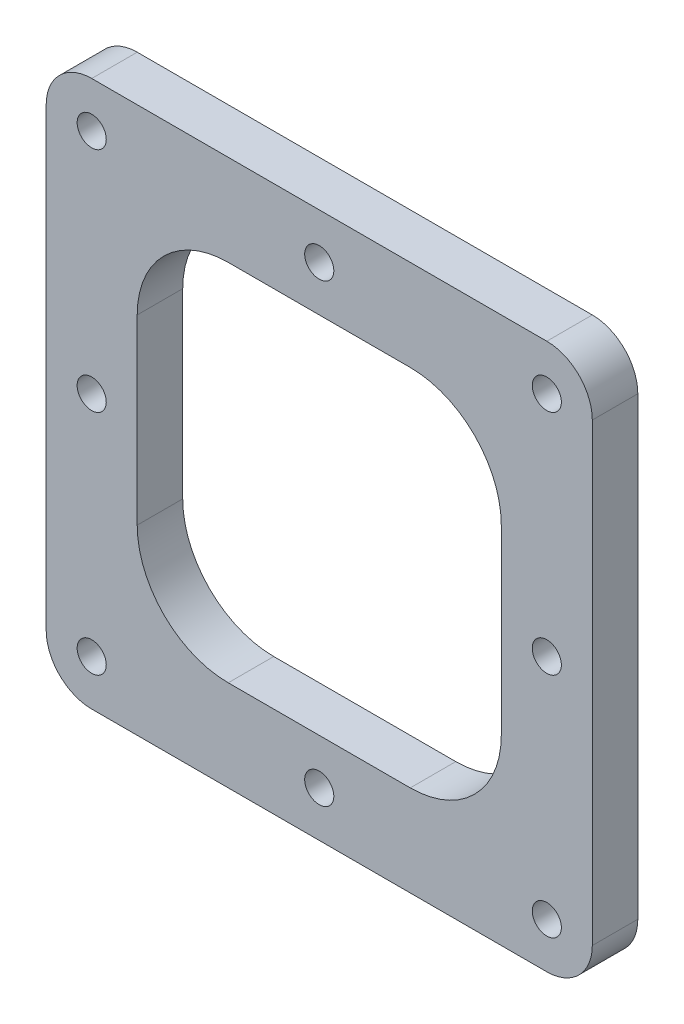
ISO-10303-21;
HEADER;
FILE_DESCRIPTION(('STEP AP214'),'2;1');
FILE_NAME('part.step','',(''),(''),'','','');
FILE_SCHEMA(('AUTOMOTIVE_DESIGN { 1 0 10303 214 1 1 1 1 }'));
ENDSEC;
DATA;
#1=APPLICATION_CONTEXT('core data for automotive mechanical design processes');
#2=APPLICATION_PROTOCOL_DEFINITION('international standard','automotive_design',2000,#1);
#3=PRODUCT_CONTEXT('',#1,'mechanical');
#4=PRODUCT('Part','Part','',(#3));
#5=PRODUCT_RELATED_PRODUCT_CATEGORY('part','',(#4));
#6=PRODUCT_DEFINITION_FORMATION('','',#4);
#7=PRODUCT_DEFINITION_CONTEXT('part definition',#1,'design');
#8=PRODUCT_DEFINITION('design','',#6,#7);
#9=PRODUCT_DEFINITION_SHAPE('','',#8);
#10=(LENGTH_UNIT() NAMED_UNIT(*) SI_UNIT(.MILLI.,.METRE.));
#11=(NAMED_UNIT(*) PLANE_ANGLE_UNIT() SI_UNIT($,.RADIAN.));
#12=(NAMED_UNIT(*) SI_UNIT($,.STERADIAN.) SOLID_ANGLE_UNIT());
#13=UNCERTAINTY_MEASURE_WITH_UNIT(LENGTH_MEASURE(1.E-05),#10,'distance_accuracy_value','');
#14=(GEOMETRIC_REPRESENTATION_CONTEXT(3) GLOBAL_UNCERTAINTY_ASSIGNED_CONTEXT((#13)) GLOBAL_UNIT_ASSIGNED_CONTEXT((#10,
#11,#12)) REPRESENTATION_CONTEXT('',''));
#15=CARTESIAN_POINT('',(0.,0.,0.));
#16=DIRECTION('',(0.,0.,1.));
#17=DIRECTION('',(1.,0.,0.));
#18=AXIS2_PLACEMENT_3D('',#15,#16,#17);
#19=CARTESIAN_POINT('',(5.,5.,5.));
#20=DIRECTION('',(0.,0.,-1.));
#21=DIRECTION('',(-1.,0.,0.));
#22=AXIS2_PLACEMENT_3D('',#19,#20,#21);
#23=CYLINDRICAL_SURFACE('',#22,5.);
#24=CARTESIAN_POINT('',(5.,5.,0.));
#25=DIRECTION('',(0.,0.,1.));
#26=DIRECTION('',(-1.,0.,0.));
#27=AXIS2_PLACEMENT_3D('',#24,#25,#26);
#28=CIRCLE('',#27,5.);
#29=CARTESIAN_POINT('',(0.,5.00000000000004,0.));
#30=VERTEX_POINT('',#29);
#31=CARTESIAN_POINT('',(5.00000000000004,0.,0.));
#32=VERTEX_POINT('',#31);
#33=EDGE_CURVE('E178',#30,#32,#28,.T.);
#34=ORIENTED_EDGE('',*,*,#33,.T.);
#35=DIRECTION('',(0.,0.,-1.));
#36=VECTOR('',#35,1.);
#37=CARTESIAN_POINT('',(5.00000000000004,0.,5.));
#38=LINE('',#37,#36);
#39=CARTESIAN_POINT('',(5.00000000000004,0.,5.));
#40=VERTEX_POINT('',#39);
#41=EDGE_CURVE('E159',#40,#32,#38,.T.);
#42=ORIENTED_EDGE('',*,*,#41,.F.);
#43=CARTESIAN_POINT('',(5.,5.,5.));
#44=DIRECTION('',(0.,0.,1.));
#45=DIRECTION('',(-1.,0.,0.));
#46=AXIS2_PLACEMENT_3D('',#43,#44,#45);
#47=CIRCLE('',#46,5.);
#48=CARTESIAN_POINT('',(0.,5.00000000000004,5.));
#49=VERTEX_POINT('',#48);
#50=EDGE_CURVE('E166',#49,#40,#47,.T.);
#51=ORIENTED_EDGE('',*,*,#50,.F.);
#52=DIRECTION('',(0.,0.,-1.));
#53=VECTOR('',#52,1.);
#54=CARTESIAN_POINT('',(0.,5.00000000000004,5.));
#55=LINE('',#54,#53);
#56=EDGE_CURVE('E269',#49,#30,#55,.T.);
#57=ORIENTED_EDGE('',*,*,#56,.T.);
#58=EDGE_LOOP('',(#34,#42,#51,#57));
#59=FACE_BOUND('',#58,.T.);
#60=ADVANCED_FACE('F41',(#59),#23,.T.);
#61=CARTESIAN_POINT('',(5.00000000000004,0.,5.));
#62=DIRECTION('',(0.,1.,0.));
#63=DIRECTION('',(0.,0.,1.));
#64=AXIS2_PLACEMENT_3D('',#61,#62,#63);
#65=PLANE('',#64);
#66=DIRECTION('',(1.,0.,0.));
#67=VECTOR('',#66,1.);
#68=CARTESIAN_POINT('',(5.00000000000004,0.,0.));
#69=LINE('',#68,#67);
#70=CARTESIAN_POINT('',(55.,0.,0.));
#71=VERTEX_POINT('',#70);
#72=EDGE_CURVE('E271',#32,#71,#69,.T.);
#73=ORIENTED_EDGE('',*,*,#72,.T.);
#74=DIRECTION('',(0.,0.,-1.));
#75=VECTOR('',#74,1.);
#76=CARTESIAN_POINT('',(55.,0.,5.));
#77=LINE('',#76,#75);
#78=CARTESIAN_POINT('',(55.,0.,5.));
#79=VERTEX_POINT('',#78);
#80=EDGE_CURVE('E162',#79,#71,#77,.T.);
#81=ORIENTED_EDGE('',*,*,#80,.F.);
#82=DIRECTION('',(1.,0.,0.));
#83=VECTOR('',#82,1.);
#84=CARTESIAN_POINT('',(5.00000000000004,0.,5.));
#85=LINE('',#84,#83);
#86=EDGE_CURVE('E155',#40,#79,#85,.T.);
#87=ORIENTED_EDGE('',*,*,#86,.F.);
#88=ORIENTED_EDGE('',*,*,#41,.T.);
#89=EDGE_LOOP('',(#73,#81,#87,#88));
#90=FACE_BOUND('',#89,.T.);
#91=ADVANCED_FACE('F157',(#90),#65,.F.);
#92=CARTESIAN_POINT('',(55.,5.,5.));
#93=DIRECTION('',(0.,0.,-1.));
#94=DIRECTION('',(-1.,0.,0.));
#95=AXIS2_PLACEMENT_3D('',#92,#93,#94);
#96=CYLINDRICAL_SURFACE('',#95,5.);
#97=CARTESIAN_POINT('',(55.,5.,0.));
#98=DIRECTION('',(0.,0.,1.));
#99=DIRECTION('',(1.,0.,0.));
#100=AXIS2_PLACEMENT_3D('',#97,#98,#99);
#101=CIRCLE('',#100,5.);
#102=CARTESIAN_POINT('',(60.,5.,0.));
#103=VERTEX_POINT('',#102);
#104=EDGE_CURVE('E273',#71,#103,#101,.T.);
#105=ORIENTED_EDGE('',*,*,#104,.T.);
#106=DIRECTION('',(0.,0.,-1.));
#107=VECTOR('',#106,1.);
#108=CARTESIAN_POINT('',(60.,5.,5.));
#109=LINE('',#108,#107);
#110=CARTESIAN_POINT('',(60.,5.,5.));
#111=VERTEX_POINT('',#110);
#112=EDGE_CURVE('E183',#111,#103,#109,.T.);
#113=ORIENTED_EDGE('',*,*,#112,.F.);
#114=CARTESIAN_POINT('',(55.,5.,5.));
#115=DIRECTION('',(0.,0.,1.));
#116=DIRECTION('',(1.,0.,0.));
#117=AXIS2_PLACEMENT_3D('',#114,#115,#116);
#118=CIRCLE('',#117,5.);
#119=EDGE_CURVE('E165',#79,#111,#118,.T.);
#120=ORIENTED_EDGE('',*,*,#119,.F.);
#121=ORIENTED_EDGE('',*,*,#80,.T.);
#122=EDGE_LOOP('',(#105,#113,#120,#121));
#123=FACE_BOUND('',#122,.T.);
#124=ADVANCED_FACE('F319',(#123),#96,.T.);
#125=CARTESIAN_POINT('',(60.,5.00000000000004,5.));
#126=DIRECTION('',(-1.,0.,0.));
#127=DIRECTION('',(0.,0.,1.));
#128=AXIS2_PLACEMENT_3D('',#125,#126,#127);
#129=PLANE('',#128);
#130=DIRECTION('',(0.,1.,0.));
#131=VECTOR('',#130,1.);
#132=CARTESIAN_POINT('',(60.,5.00000000000004,0.));
#133=LINE('',#132,#131);
#134=CARTESIAN_POINT('',(60.,55.,0.));
#135=VERTEX_POINT('',#134);
#136=EDGE_CURVE('E275',#103,#135,#133,.T.);
#137=ORIENTED_EDGE('',*,*,#136,.T.);
#138=DIRECTION('',(0.,0.,-1.));
#139=VECTOR('',#138,1.);
#140=CARTESIAN_POINT('',(60.,55.,5.));
#141=LINE('',#140,#139);
#142=CARTESIAN_POINT('',(60.,55.,5.));
#143=VERTEX_POINT('',#142);
#144=EDGE_CURVE('E294',#143,#135,#141,.T.);
#145=ORIENTED_EDGE('',*,*,#144,.F.);
#146=DIRECTION('',(0.,1.,0.));
#147=VECTOR('',#146,1.);
#148=CARTESIAN_POINT('',(60.,5.00000000000004,5.));
#149=LINE('',#148,#147);
#150=EDGE_CURVE('E260',#111,#143,#149,.T.);
#151=ORIENTED_EDGE('',*,*,#150,.F.);
#152=ORIENTED_EDGE('',*,*,#112,.T.);
#153=EDGE_LOOP('',(#137,#145,#151,#152));
#154=FACE_BOUND('',#153,.T.);
#155=ADVANCED_FACE('F301',(#154),#129,.F.);
#156=CARTESIAN_POINT('',(55.,55.,5.));
#157=DIRECTION('',(0.,0.,-1.));
#158=DIRECTION('',(-1.,0.,0.));
#159=AXIS2_PLACEMENT_3D('',#156,#157,#158);
#160=CYLINDRICAL_SURFACE('',#159,5.);
#161=CARTESIAN_POINT('',(55.,55.,0.));
#162=DIRECTION('',(0.,0.,1.));
#163=DIRECTION('',(-1.,0.,0.));
#164=AXIS2_PLACEMENT_3D('',#161,#162,#163);
#165=CIRCLE('',#164,5.);
#166=CARTESIAN_POINT('',(55.,60.,0.));
#167=VERTEX_POINT('',#166);
#168=EDGE_CURVE('E277',#135,#167,#165,.T.);
#169=ORIENTED_EDGE('',*,*,#168,.T.);
#170=DIRECTION('',(0.,0.,-1.));
#171=VECTOR('',#170,1.);
#172=CARTESIAN_POINT('',(55.,60.,5.));
#173=LINE('',#172,#171);
#174=CARTESIAN_POINT('',(55.,60.,5.));
#175=VERTEX_POINT('',#174);
#176=EDGE_CURVE('E291',#175,#167,#173,.T.);
#177=ORIENTED_EDGE('',*,*,#176,.F.);
#178=CARTESIAN_POINT('',(55.,55.,5.));
#179=DIRECTION('',(0.,0.,1.));
#180=DIRECTION('',(-1.,0.,0.));
#181=AXIS2_PLACEMENT_3D('',#178,#179,#180);
#182=CIRCLE('',#181,5.);
#183=EDGE_CURVE('E262',#143,#175,#182,.T.);
#184=ORIENTED_EDGE('',*,*,#183,.F.);
#185=ORIENTED_EDGE('',*,*,#144,.T.);
#186=EDGE_LOOP('',(#169,#177,#184,#185));
#187=FACE_BOUND('',#186,.T.);
#188=ADVANCED_FACE('F311',(#187),#160,.T.);
#189=CARTESIAN_POINT('',(5.00000000000004,60.,5.));
#190=DIRECTION('',(0.,-1.,0.));
#191=DIRECTION('',(0.,0.,-1.));
#192=AXIS2_PLACEMENT_3D('',#189,#190,#191);
#193=PLANE('',#192);
#194=DIRECTION('',(-1.,0.,0.));
#195=VECTOR('',#194,1.);
#196=CARTESIAN_POINT('',(5.00000000000004,60.,0.));
#197=LINE('',#196,#195);
#198=CARTESIAN_POINT('',(5.00000000000004,60.,0.));
#199=VERTEX_POINT('',#198);
#200=EDGE_CURVE('E279',#167,#199,#197,.T.);
#201=ORIENTED_EDGE('',*,*,#200,.T.);
#202=DIRECTION('',(0.,0.,-1.));
#203=VECTOR('',#202,1.);
#204=CARTESIAN_POINT('',(5.00000000000004,60.,5.));
#205=LINE('',#204,#203);
#206=CARTESIAN_POINT('',(5.00000000000004,60.,5.));
#207=VERTEX_POINT('',#206);
#208=EDGE_CURVE('E288',#207,#199,#205,.T.);
#209=ORIENTED_EDGE('',*,*,#208,.F.);
#210=DIRECTION('',(-1.,0.,0.));
#211=VECTOR('',#210,1.);
#212=CARTESIAN_POINT('',(5.00000000000004,60.,5.));
#213=LINE('',#212,#211);
#214=EDGE_CURVE('E264',#175,#207,#213,.T.);
#215=ORIENTED_EDGE('',*,*,#214,.F.);
#216=ORIENTED_EDGE('',*,*,#176,.T.);
#217=EDGE_LOOP('',(#201,#209,#215,#216));
#218=FACE_BOUND('',#217,.T.);
#219=ADVANCED_FACE('F315',(#218),#193,.F.);
#220=CARTESIAN_POINT('',(5.,55.,5.));
#221=DIRECTION('',(0.,0.,-1.));
#222=DIRECTION('',(-1.,0.,0.));
#223=AXIS2_PLACEMENT_3D('',#220,#221,#222);
#224=CYLINDRICAL_SURFACE('',#223,5.);
#225=CARTESIAN_POINT('',(5.,55.,0.));
#226=DIRECTION('',(0.,0.,1.));
#227=DIRECTION('',(-1.,0.,0.));
#228=AXIS2_PLACEMENT_3D('',#225,#226,#227);
#229=CIRCLE('',#228,5.);
#230=CARTESIAN_POINT('',(0.,55.,0.));
#231=VERTEX_POINT('',#230);
#232=EDGE_CURVE('E281',#199,#231,#229,.T.);
#233=ORIENTED_EDGE('',*,*,#232,.T.);
#234=DIRECTION('',(0.,0.,-1.));
#235=VECTOR('',#234,1.);
#236=CARTESIAN_POINT('',(0.,55.,5.));
#237=LINE('',#236,#235);
#238=CARTESIAN_POINT('',(0.,55.,5.));
#239=VERTEX_POINT('',#238);
#240=EDGE_CURVE('E285',#239,#231,#237,.T.);
#241=ORIENTED_EDGE('',*,*,#240,.F.);
#242=CARTESIAN_POINT('',(5.,55.,5.));
#243=DIRECTION('',(0.,0.,1.));
#244=DIRECTION('',(-1.,0.,0.));
#245=AXIS2_PLACEMENT_3D('',#242,#243,#244);
#246=CIRCLE('',#245,5.);
#247=EDGE_CURVE('E266',#207,#239,#246,.T.);
#248=ORIENTED_EDGE('',*,*,#247,.F.);
#249=ORIENTED_EDGE('',*,*,#208,.T.);
#250=EDGE_LOOP('',(#233,#241,#248,#249));
#251=FACE_BOUND('',#250,.T.);
#252=ADVANCED_FACE('F401',(#251),#224,.T.);
#253=CARTESIAN_POINT('',(0.,5.00000000000004,5.));
#254=DIRECTION('',(1.,0.,0.));
#255=DIRECTION('',(0.,0.,-1.));
#256=AXIS2_PLACEMENT_3D('',#253,#254,#255);
#257=PLANE('',#256);
#258=DIRECTION('',(0.,-1.,0.));
#259=VECTOR('',#258,1.);
#260=CARTESIAN_POINT('',(0.,5.00000000000004,0.));
#261=LINE('',#260,#259);
#262=EDGE_CURVE('E175',#231,#30,#261,.T.);
#263=ORIENTED_EDGE('',*,*,#262,.T.);
#264=ORIENTED_EDGE('',*,*,#56,.F.);
#265=DIRECTION('',(0.,-1.,0.));
#266=VECTOR('',#265,1.);
#267=CARTESIAN_POINT('',(0.,5.00000000000004,5.));
#268=LINE('',#267,#266);
#269=EDGE_CURVE('E171',#239,#49,#268,.T.);
#270=ORIENTED_EDGE('',*,*,#269,.F.);
#271=ORIENTED_EDGE('',*,*,#240,.T.);
#272=EDGE_LOOP('',(#263,#264,#270,#271));
#273=FACE_BOUND('',#272,.T.);
#274=ADVANCED_FACE('F394',(#273),#257,.F.);
#275=CARTESIAN_POINT('',(5.,5.,5.));
#276=DIRECTION('',(0.,0.,-1.));
#277=DIRECTION('',(-1.,0.,0.));
#278=AXIS2_PLACEMENT_3D('',#275,#276,#277);
#279=PLANE('',#278);
#280=CARTESIAN_POINT('',(30.,55.,5.));
#281=DIRECTION('',(0.,0.,1.));
#282=DIRECTION('',(1.,0.,0.));
#283=AXIS2_PLACEMENT_3D('',#280,#281,#282);
#284=CIRCLE('',#283,1.6);
#285=CARTESIAN_POINT('',(31.6,55.,5.));
#286=VERTEX_POINT('',#285);
#287=EDGE_CURVE('E257',#286,#286,#284,.T.);
#288=ORIENTED_EDGE('',*,*,#287,.F.);
#289=EDGE_LOOP('',(#288));
#290=FACE_BOUND('',#289,.T.);
#291=CARTESIAN_POINT('',(55.,55.,5.));
#292=DIRECTION('',(0.,0.,1.));
#293=DIRECTION('',(1.,0.,0.));
#294=AXIS2_PLACEMENT_3D('',#291,#292,#293);
#295=CIRCLE('',#294,1.6);
#296=CARTESIAN_POINT('',(56.6,55.,5.));
#297=VERTEX_POINT('',#296);
#298=EDGE_CURVE('E582',#297,#297,#295,.T.);
#299=ORIENTED_EDGE('',*,*,#298,.F.);
#300=EDGE_LOOP('',(#299));
#301=FACE_BOUND('',#300,.T.);
#302=DIRECTION('',(1.,0.,0.));
#303=VECTOR('',#302,1.);
#304=CARTESIAN_POINT('',(10.,10.,5.));
#305=LINE('',#304,#303);
#306=CARTESIAN_POINT('',(20.,10.,5.));
#307=VERTEX_POINT('',#306);
#308=CARTESIAN_POINT('',(40.,10.,5.));
#309=VERTEX_POINT('',#308);
#310=EDGE_CURVE('E354',#307,#309,#305,.T.);
#311=ORIENTED_EDGE('',*,*,#310,.F.);
#312=CARTESIAN_POINT('',(20.,20.,5.));
#313=DIRECTION('',(0.,0.,-1.));
#314=DIRECTION('',(-1.,0.,0.));
#315=AXIS2_PLACEMENT_3D('',#312,#313,#314);
#316=CIRCLE('',#315,10.);
#317=CARTESIAN_POINT('',(10.,20.,5.));
#318=VERTEX_POINT('',#317);
#319=EDGE_CURVE('E203',#307,#318,#316,.T.);
#320=ORIENTED_EDGE('',*,*,#319,.T.);
#321=DIRECTION('',(0.,-1.,0.));
#322=VECTOR('',#321,1.);
#323=CARTESIAN_POINT('',(10.,50.,5.));
#324=LINE('',#323,#322);
#325=CARTESIAN_POINT('',(10.,40.,5.));
#326=VERTEX_POINT('',#325);
#327=EDGE_CURVE('E220',#326,#318,#324,.T.);
#328=ORIENTED_EDGE('',*,*,#327,.F.);
#329=CARTESIAN_POINT('',(20.,40.,5.));
#330=DIRECTION('',(0.,0.,-1.));
#331=DIRECTION('',(-1.,0.,0.));
#332=AXIS2_PLACEMENT_3D('',#329,#330,#331);
#333=CIRCLE('',#332,10.);
#334=CARTESIAN_POINT('',(20.,50.,5.));
#335=VERTEX_POINT('',#334);
#336=EDGE_CURVE('E49',#326,#335,#333,.T.);
#337=ORIENTED_EDGE('',*,*,#336,.T.);
#338=DIRECTION('',(-1.,0.,0.));
#339=VECTOR('',#338,1.);
#340=CARTESIAN_POINT('',(50.,50.,5.));
#341=LINE('',#340,#339);
#342=CARTESIAN_POINT('',(40.,50.,5.));
#343=VERTEX_POINT('',#342);
#344=EDGE_CURVE('E218',#343,#335,#341,.T.);
#345=ORIENTED_EDGE('',*,*,#344,.F.);
#346=CARTESIAN_POINT('',(40.,40.,5.));
#347=DIRECTION('',(0.,0.,-1.));
#348=DIRECTION('',(-1.,0.,0.));
#349=AXIS2_PLACEMENT_3D('',#346,#347,#348);
#350=CIRCLE('',#349,10.);
#351=CARTESIAN_POINT('',(50.,40.,5.));
#352=VERTEX_POINT('',#351);
#353=EDGE_CURVE('E211',#343,#352,#350,.T.);
#354=ORIENTED_EDGE('',*,*,#353,.T.);
#355=DIRECTION('',(0.,1.,0.));
#356=VECTOR('',#355,1.);
#357=CARTESIAN_POINT('',(50.,10.,5.));
#358=LINE('',#357,#356);
#359=CARTESIAN_POINT('',(50.,20.,5.));
#360=VERTEX_POINT('',#359);
#361=EDGE_CURVE('E225',#360,#352,#358,.T.);
#362=ORIENTED_EDGE('',*,*,#361,.F.);
#363=CARTESIAN_POINT('',(40.,20.,5.));
#364=DIRECTION('',(0.,0.,-1.));
#365=DIRECTION('',(-1.,0.,0.));
#366=AXIS2_PLACEMENT_3D('',#363,#364,#365);
#367=CIRCLE('',#366,10.);
#368=EDGE_CURVE('E207',#360,#309,#367,.T.);
#369=ORIENTED_EDGE('',*,*,#368,.T.);
#370=EDGE_LOOP('',(#311,#320,#328,#337,#345,#354,#362,#369));
#371=FACE_BOUND('',#370,.T.);
#372=CARTESIAN_POINT('',(55.0000000000003,30.,5.));
#373=DIRECTION('',(0.,0.,1.));
#374=DIRECTION('',(1.,0.,0.));
#375=AXIS2_PLACEMENT_3D('',#372,#373,#374);
#376=CIRCLE('',#375,1.6);
#377=CARTESIAN_POINT('',(56.6000000000003,30.,5.));
#378=VERTEX_POINT('',#377);
#379=EDGE_CURVE('E245',#378,#378,#376,.T.);
#380=ORIENTED_EDGE('',*,*,#379,.F.);
#381=EDGE_LOOP('',(#380));
#382=FACE_BOUND('',#381,.T.);
#383=CARTESIAN_POINT('',(30.0000000000005,5.,5.));
#384=DIRECTION('',(0.,0.,1.));
#385=DIRECTION('',(1.,0.,0.));
#386=AXIS2_PLACEMENT_3D('',#383,#384,#385);
#387=CIRCLE('',#386,1.6);
#388=CARTESIAN_POINT('',(31.6000000000005,5.,5.));
#389=VERTEX_POINT('',#388);
#390=EDGE_CURVE('E251',#389,#389,#387,.T.);
#391=ORIENTED_EDGE('',*,*,#390,.F.);
#392=EDGE_LOOP('',(#391));
#393=FACE_BOUND('',#392,.T.);
#394=CARTESIAN_POINT('',(55.0000000000005,5.,5.));
#395=DIRECTION('',(0.,0.,1.));
#396=DIRECTION('',(1.,0.,0.));
#397=AXIS2_PLACEMENT_3D('',#394,#395,#396);
#398=CIRCLE('',#397,1.6);
#399=CARTESIAN_POINT('',(56.6000000000005,5.,5.));
#400=VERTEX_POINT('',#399);
#401=EDGE_CURVE('E608',#400,#400,#398,.T.);
#402=ORIENTED_EDGE('',*,*,#401,.F.);
#403=EDGE_LOOP('',(#402));
#404=FACE_BOUND('',#403,.T.);
#405=CARTESIAN_POINT('',(5.00000000000026,30.,5.));
#406=DIRECTION('',(0.,0.,1.));
#407=DIRECTION('',(1.,0.,0.));
#408=AXIS2_PLACEMENT_3D('',#405,#406,#407);
#409=CIRCLE('',#408,1.6);
#410=CARTESIAN_POINT('',(6.60000000000026,30.,5.));
#411=VERTEX_POINT('',#410);
#412=EDGE_CURVE('E602',#411,#411,#409,.T.);
#413=ORIENTED_EDGE('',*,*,#412,.F.);
#414=EDGE_LOOP('',(#413));
#415=FACE_BOUND('',#414,.T.);
#416=CARTESIAN_POINT('',(5.00000000000052,5.,5.));
#417=DIRECTION('',(0.,0.,1.));
#418=DIRECTION('',(1.,0.,0.));
#419=AXIS2_PLACEMENT_3D('',#416,#417,#418);
#420=CIRCLE('',#419,1.6);
#421=CARTESIAN_POINT('',(6.60000000000052,5.,5.));
#422=VERTEX_POINT('',#421);
#423=EDGE_CURVE('E596',#422,#422,#420,.T.);
#424=ORIENTED_EDGE('',*,*,#423,.F.);
#425=EDGE_LOOP('',(#424));
#426=FACE_BOUND('',#425,.T.);
#427=CARTESIAN_POINT('',(5.,55.,5.));
#428=DIRECTION('',(0.,0.,1.));
#429=DIRECTION('',(1.,0.,0.));
#430=AXIS2_PLACEMENT_3D('',#427,#428,#429);
#431=CIRCLE('',#430,1.6);
#432=CARTESIAN_POINT('',(6.6,55.,5.));
#433=VERTEX_POINT('',#432);
#434=EDGE_CURVE('E255',#433,#433,#431,.T.);
#435=ORIENTED_EDGE('',*,*,#434,.F.);
#436=EDGE_LOOP('',(#435));
#437=FACE_BOUND('',#436,.T.);
#438=ORIENTED_EDGE('',*,*,#50,.T.);
#439=ORIENTED_EDGE('',*,*,#86,.T.);
#440=ORIENTED_EDGE('',*,*,#119,.T.);
#441=ORIENTED_EDGE('',*,*,#150,.T.);
#442=ORIENTED_EDGE('',*,*,#183,.T.);
#443=ORIENTED_EDGE('',*,*,#214,.T.);
#444=ORIENTED_EDGE('',*,*,#247,.T.);
#445=ORIENTED_EDGE('',*,*,#269,.T.);
#446=EDGE_LOOP('',(#438,#439,#440,#441,#442,#443,#444,#445));
#447=FACE_BOUND('',#446,.T.);
#448=ADVANCED_FACE('F169',(#290,#301,#371,#382,#393,#404,#415,#426,#437,#447),#279,.F.);
#449=CARTESIAN_POINT('',(5.,5.,0.));
#450=DIRECTION('',(0.,0.,-1.));
#451=DIRECTION('',(-1.,0.,0.));
#452=AXIS2_PLACEMENT_3D('',#449,#450,#451);
#453=PLANE('',#452);
#454=CARTESIAN_POINT('',(30.,55.,0.));
#455=DIRECTION('',(0.,0.,1.));
#456=DIRECTION('',(1.,0.,0.));
#457=AXIS2_PLACEMENT_3D('',#454,#455,#456);
#458=CIRCLE('',#457,1.6);
#459=CARTESIAN_POINT('',(31.6,55.,0.));
#460=VERTEX_POINT('',#459);
#461=EDGE_CURVE('E578',#460,#460,#458,.T.);
#462=ORIENTED_EDGE('',*,*,#461,.T.);
#463=EDGE_LOOP('',(#462));
#464=FACE_BOUND('',#463,.T.);
#465=CARTESIAN_POINT('',(55.,55.,0.));
#466=DIRECTION('',(0.,0.,1.));
#467=DIRECTION('',(1.,0.,0.));
#468=AXIS2_PLACEMENT_3D('',#465,#466,#467);
#469=CIRCLE('',#468,1.6);
#470=CARTESIAN_POINT('',(56.6,55.,0.));
#471=VERTEX_POINT('',#470);
#472=EDGE_CURVE('E361',#471,#471,#469,.T.);
#473=ORIENTED_EDGE('',*,*,#472,.T.);
#474=EDGE_LOOP('',(#473));
#475=FACE_BOUND('',#474,.T.);
#476=DIRECTION('',(-1.,0.,0.));
#477=VECTOR('',#476,1.);
#478=CARTESIAN_POINT('',(50.,50.,0.));
#479=LINE('',#478,#477);
#480=CARTESIAN_POINT('',(40.,50.,0.));
#481=VERTEX_POINT('',#480);
#482=CARTESIAN_POINT('',(20.,50.,0.));
#483=VERTEX_POINT('',#482);
#484=EDGE_CURVE('E234',#481,#483,#479,.T.);
#485=ORIENTED_EDGE('',*,*,#484,.T.);
#486=CARTESIAN_POINT('',(20.,40.,0.));
#487=DIRECTION('',(0.,0.,-1.));
#488=DIRECTION('',(-1.,0.,0.));
#489=AXIS2_PLACEMENT_3D('',#486,#487,#488);
#490=CIRCLE('',#489,10.);
#491=CARTESIAN_POINT('',(10.,40.,0.));
#492=VERTEX_POINT('',#491);
#493=EDGE_CURVE('E11',#483,#492,#490,.F.);
#494=ORIENTED_EDGE('',*,*,#493,.T.);
#495=DIRECTION('',(0.,-1.,0.));
#496=VECTOR('',#495,1.);
#497=CARTESIAN_POINT('',(10.,50.,0.));
#498=LINE('',#497,#496);
#499=CARTESIAN_POINT('',(10.,20.,0.));
#500=VERTEX_POINT('',#499);
#501=EDGE_CURVE('E226',#492,#500,#498,.T.);
#502=ORIENTED_EDGE('',*,*,#501,.T.);
#503=CARTESIAN_POINT('',(20.,20.,0.));
#504=DIRECTION('',(0.,0.,-1.));
#505=DIRECTION('',(-1.,0.,0.));
#506=AXIS2_PLACEMENT_3D('',#503,#504,#505);
#507=CIRCLE('',#506,10.);
#508=CARTESIAN_POINT('',(20.,10.,0.));
#509=VERTEX_POINT('',#508);
#510=EDGE_CURVE('E205',#500,#509,#507,.F.);
#511=ORIENTED_EDGE('',*,*,#510,.T.);
#512=DIRECTION('',(1.,0.,0.));
#513=VECTOR('',#512,1.);
#514=CARTESIAN_POINT('',(10.,10.,0.));
#515=LINE('',#514,#513);
#516=CARTESIAN_POINT('',(40.,10.,0.));
#517=VERTEX_POINT('',#516);
#518=EDGE_CURVE('E238',#509,#517,#515,.T.);
#519=ORIENTED_EDGE('',*,*,#518,.T.);
#520=CARTESIAN_POINT('',(40.,20.,0.));
#521=DIRECTION('',(0.,0.,-1.));
#522=DIRECTION('',(-1.,0.,0.));
#523=AXIS2_PLACEMENT_3D('',#520,#521,#522);
#524=CIRCLE('',#523,10.);
#525=CARTESIAN_POINT('',(50.,20.,0.));
#526=VERTEX_POINT('',#525);
#527=EDGE_CURVE('E209',#517,#526,#524,.F.);
#528=ORIENTED_EDGE('',*,*,#527,.T.);
#529=DIRECTION('',(0.,1.,0.));
#530=VECTOR('',#529,1.);
#531=CARTESIAN_POINT('',(50.,10.,0.));
#532=LINE('',#531,#530);
#533=CARTESIAN_POINT('',(50.,40.,0.));
#534=VERTEX_POINT('',#533);
#535=EDGE_CURVE('E241',#526,#534,#532,.T.);
#536=ORIENTED_EDGE('',*,*,#535,.T.);
#537=CARTESIAN_POINT('',(40.,40.,0.));
#538=DIRECTION('',(0.,0.,-1.));
#539=DIRECTION('',(-1.,0.,0.));
#540=AXIS2_PLACEMENT_3D('',#537,#538,#539);
#541=CIRCLE('',#540,10.);
#542=EDGE_CURVE('E63',#534,#481,#541,.F.);
#543=ORIENTED_EDGE('',*,*,#542,.T.);
#544=EDGE_LOOP('',(#485,#494,#502,#511,#519,#528,#536,#543));
#545=FACE_BOUND('',#544,.T.);
#546=CARTESIAN_POINT('',(55.0000000000003,30.,0.));
#547=DIRECTION('',(0.,0.,1.));
#548=DIRECTION('',(1.,0.,0.));
#549=AXIS2_PLACEMENT_3D('',#546,#547,#548);
#550=CIRCLE('',#549,1.6);
#551=CARTESIAN_POINT('',(56.6000000000003,30.,0.));
#552=VERTEX_POINT('',#551);
#553=EDGE_CURVE('E248',#552,#552,#550,.T.);
#554=ORIENTED_EDGE('',*,*,#553,.T.);
#555=EDGE_LOOP('',(#554));
#556=FACE_BOUND('',#555,.T.);
#557=CARTESIAN_POINT('',(30.0000000000005,5.,0.));
#558=DIRECTION('',(0.,0.,1.));
#559=DIRECTION('',(1.,0.,0.));
#560=AXIS2_PLACEMENT_3D('',#557,#558,#559);
#561=CIRCLE('',#560,1.6);
#562=CARTESIAN_POINT('',(31.6000000000005,5.,0.));
#563=VERTEX_POINT('',#562);
#564=EDGE_CURVE('E611',#563,#563,#561,.T.);
#565=ORIENTED_EDGE('',*,*,#564,.T.);
#566=EDGE_LOOP('',(#565));
#567=FACE_BOUND('',#566,.T.);
#568=CARTESIAN_POINT('',(55.0000000000005,5.,0.));
#569=DIRECTION('',(0.,0.,1.));
#570=DIRECTION('',(1.,0.,0.));
#571=AXIS2_PLACEMENT_3D('',#568,#569,#570);
#572=CIRCLE('',#571,1.6);
#573=CARTESIAN_POINT('',(56.6000000000005,5.,0.));
#574=VERTEX_POINT('',#573);
#575=EDGE_CURVE('E605',#574,#574,#572,.T.);
#576=ORIENTED_EDGE('',*,*,#575,.T.);
#577=EDGE_LOOP('',(#576));
#578=FACE_BOUND('',#577,.T.);
#579=CARTESIAN_POINT('',(5.00000000000026,30.,0.));
#580=DIRECTION('',(0.,0.,1.));
#581=DIRECTION('',(1.,0.,0.));
#582=AXIS2_PLACEMENT_3D('',#579,#580,#581);
#583=CIRCLE('',#582,1.6);
#584=CARTESIAN_POINT('',(6.60000000000026,30.,0.));
#585=VERTEX_POINT('',#584);
#586=EDGE_CURVE('E599',#585,#585,#583,.T.);
#587=ORIENTED_EDGE('',*,*,#586,.T.);
#588=EDGE_LOOP('',(#587));
#589=FACE_BOUND('',#588,.T.);
#590=CARTESIAN_POINT('',(5.00000000000052,5.,0.));
#591=DIRECTION('',(0.,0.,1.));
#592=DIRECTION('',(1.,0.,0.));
#593=AXIS2_PLACEMENT_3D('',#590,#591,#592);
#594=CIRCLE('',#593,1.6);
#595=CARTESIAN_POINT('',(6.60000000000052,5.,0.));
#596=VERTEX_POINT('',#595);
#597=EDGE_CURVE('E585',#596,#596,#594,.T.);
#598=ORIENTED_EDGE('',*,*,#597,.T.);
#599=EDGE_LOOP('',(#598));
#600=FACE_BOUND('',#599,.T.);
#601=CARTESIAN_POINT('',(5.,55.,0.));
#602=DIRECTION('',(0.,0.,1.));
#603=DIRECTION('',(1.,0.,0.));
#604=AXIS2_PLACEMENT_3D('',#601,#602,#603);
#605=CIRCLE('',#604,1.6);
#606=CARTESIAN_POINT('',(6.6,55.,0.));
#607=VERTEX_POINT('',#606);
#608=EDGE_CURVE('E252',#607,#607,#605,.T.);
#609=ORIENTED_EDGE('',*,*,#608,.T.);
#610=EDGE_LOOP('',(#609));
#611=FACE_BOUND('',#610,.T.);
#612=ORIENTED_EDGE('',*,*,#33,.F.);
#613=ORIENTED_EDGE('',*,*,#262,.F.);
#614=ORIENTED_EDGE('',*,*,#232,.F.);
#615=ORIENTED_EDGE('',*,*,#200,.F.);
#616=ORIENTED_EDGE('',*,*,#168,.F.);
#617=ORIENTED_EDGE('',*,*,#136,.F.);
#618=ORIENTED_EDGE('',*,*,#104,.F.);
#619=ORIENTED_EDGE('',*,*,#72,.F.);
#620=EDGE_LOOP('',(#612,#613,#614,#615,#616,#617,#618,#619));
#621=FACE_BOUND('',#620,.T.);
#622=ADVANCED_FACE('F231',(#464,#475,#545,#556,#567,#578,#589,#600,#611,#621),#453,.T.);
#623=CARTESIAN_POINT('',(5.,55.,0.));
#624=DIRECTION('',(0.,0.,1.));
#625=DIRECTION('',(1.,0.,0.));
#626=AXIS2_PLACEMENT_3D('',#623,#624,#625);
#627=CYLINDRICAL_SURFACE('',#626,1.6);
#628=ORIENTED_EDGE('',*,*,#608,.F.);
#629=EDGE_LOOP('',(#628));
#630=FACE_BOUND('',#629,.T.);
#631=ORIENTED_EDGE('',*,*,#434,.T.);
#632=EDGE_LOOP('',(#631));
#633=FACE_BOUND('',#632,.T.);
#634=ADVANCED_FACE('F387',(#630,#633),#627,.F.);
#635=CARTESIAN_POINT('',(5.00000000000052,5.,0.));
#636=DIRECTION('',(0.,0.,1.));
#637=DIRECTION('',(1.,0.,0.));
#638=AXIS2_PLACEMENT_3D('',#635,#636,#637);
#639=CYLINDRICAL_SURFACE('',#638,1.6);
#640=ORIENTED_EDGE('',*,*,#597,.F.);
#641=EDGE_LOOP('',(#640));
#642=FACE_BOUND('',#641,.T.);
#643=ORIENTED_EDGE('',*,*,#423,.T.);
#644=EDGE_LOOP('',(#643));
#645=FACE_BOUND('',#644,.T.);
#646=ADVANCED_FACE('F390',(#642,#645),#639,.F.);
#647=CARTESIAN_POINT('',(5.00000000000026,30.,0.));
#648=DIRECTION('',(0.,0.,1.));
#649=DIRECTION('',(1.,0.,0.));
#650=AXIS2_PLACEMENT_3D('',#647,#648,#649);
#651=CYLINDRICAL_SURFACE('',#650,1.6);
#652=ORIENTED_EDGE('',*,*,#586,.F.);
#653=EDGE_LOOP('',(#652));
#654=FACE_BOUND('',#653,.T.);
#655=ORIENTED_EDGE('',*,*,#412,.T.);
#656=EDGE_LOOP('',(#655));
#657=FACE_BOUND('',#656,.T.);
#658=ADVANCED_FACE('F442',(#654,#657),#651,.F.);
#659=CARTESIAN_POINT('',(55.0000000000005,5.,0.));
#660=DIRECTION('',(0.,0.,1.));
#661=DIRECTION('',(1.,0.,0.));
#662=AXIS2_PLACEMENT_3D('',#659,#660,#661);
#663=CYLINDRICAL_SURFACE('',#662,1.6);
#664=ORIENTED_EDGE('',*,*,#575,.F.);
#665=EDGE_LOOP('',(#664));
#666=FACE_BOUND('',#665,.T.);
#667=ORIENTED_EDGE('',*,*,#401,.T.);
#668=EDGE_LOOP('',(#667));
#669=FACE_BOUND('',#668,.T.);
#670=ADVANCED_FACE('F451',(#666,#669),#663,.F.);
#671=CARTESIAN_POINT('',(30.0000000000005,5.,0.));
#672=DIRECTION('',(0.,0.,1.));
#673=DIRECTION('',(1.,0.,0.));
#674=AXIS2_PLACEMENT_3D('',#671,#672,#673);
#675=CYLINDRICAL_SURFACE('',#674,1.6);
#676=ORIENTED_EDGE('',*,*,#564,.F.);
#677=EDGE_LOOP('',(#676));
#678=FACE_BOUND('',#677,.T.);
#679=ORIENTED_EDGE('',*,*,#390,.T.);
#680=EDGE_LOOP('',(#679));
#681=FACE_BOUND('',#680,.T.);
#682=ADVANCED_FACE('F385',(#678,#681),#675,.F.);
#683=CARTESIAN_POINT('',(55.0000000000003,30.,0.));
#684=DIRECTION('',(0.,0.,1.));
#685=DIRECTION('',(1.,0.,0.));
#686=AXIS2_PLACEMENT_3D('',#683,#684,#685);
#687=CYLINDRICAL_SURFACE('',#686,1.6);
#688=ORIENTED_EDGE('',*,*,#553,.F.);
#689=EDGE_LOOP('',(#688));
#690=FACE_BOUND('',#689,.T.);
#691=ORIENTED_EDGE('',*,*,#379,.T.);
#692=EDGE_LOOP('',(#691));
#693=FACE_BOUND('',#692,.T.);
#694=ADVANCED_FACE('F382',(#690,#693),#687,.F.);
#695=CARTESIAN_POINT('',(10.,50.,0.));
#696=DIRECTION('',(-1.,0.,0.));
#697=DIRECTION('',(0.,0.,1.));
#698=AXIS2_PLACEMENT_3D('',#695,#696,#697);
#699=PLANE('',#698);
#700=ORIENTED_EDGE('',*,*,#327,.T.);
#701=DIRECTION('',(0.,0.,1.));
#702=VECTOR('',#701,1.);
#703=CARTESIAN_POINT('',(10.,20.,0.));
#704=LINE('',#703,#702);
#705=EDGE_CURVE('E192',#318,#500,#704,.F.);
#706=ORIENTED_EDGE('',*,*,#705,.T.);
#707=ORIENTED_EDGE('',*,*,#501,.F.);
#708=DIRECTION('',(0.,0.,1.));
#709=VECTOR('',#708,1.);
#710=CARTESIAN_POINT('',(10.,40.,5.));
#711=LINE('',#710,#709);
#712=EDGE_CURVE('E189',#492,#326,#711,.T.);
#713=ORIENTED_EDGE('',*,*,#712,.T.);
#714=EDGE_LOOP('',(#700,#706,#707,#713));
#715=FACE_BOUND('',#714,.T.);
#716=ADVANCED_FACE('F236',(#715),#699,.F.);
#717=CARTESIAN_POINT('',(50.,50.,0.));
#718=DIRECTION('',(0.,1.,0.));
#719=DIRECTION('',(0.,0.,1.));
#720=AXIS2_PLACEMENT_3D('',#717,#718,#719);
#721=PLANE('',#720);
#722=ORIENTED_EDGE('',*,*,#484,.F.);
#723=DIRECTION('',(0.,0.,1.));
#724=VECTOR('',#723,1.);
#725=CARTESIAN_POINT('',(40.,50.,5.));
#726=LINE('',#725,#724);
#727=EDGE_CURVE('E200',#481,#343,#726,.T.);
#728=ORIENTED_EDGE('',*,*,#727,.T.);
#729=ORIENTED_EDGE('',*,*,#344,.T.);
#730=DIRECTION('',(0.,0.,1.));
#731=VECTOR('',#730,1.);
#732=CARTESIAN_POINT('',(20.,50.,0.));
#733=LINE('',#732,#731);
#734=EDGE_CURVE('E56',#335,#483,#733,.F.);
#735=ORIENTED_EDGE('',*,*,#734,.T.);
#736=EDGE_LOOP('',(#722,#728,#729,#735));
#737=FACE_BOUND('',#736,.T.);
#738=ADVANCED_FACE('F223',(#737),#721,.F.);
#739=CARTESIAN_POINT('',(50.,10.,0.));
#740=DIRECTION('',(1.,0.,0.));
#741=DIRECTION('',(0.,0.,-1.));
#742=AXIS2_PLACEMENT_3D('',#739,#740,#741);
#743=PLANE('',#742);
#744=ORIENTED_EDGE('',*,*,#535,.F.);
#745=DIRECTION('',(0.,0.,1.));
#746=VECTOR('',#745,1.);
#747=CARTESIAN_POINT('',(50.,20.,5.));
#748=LINE('',#747,#746);
#749=EDGE_CURVE('E196',#526,#360,#748,.T.);
#750=ORIENTED_EDGE('',*,*,#749,.T.);
#751=ORIENTED_EDGE('',*,*,#361,.T.);
#752=DIRECTION('',(0.,0.,1.));
#753=VECTOR('',#752,1.);
#754=CARTESIAN_POINT('',(50.,40.,0.));
#755=LINE('',#754,#753);
#756=EDGE_CURVE('E194',#352,#534,#755,.F.);
#757=ORIENTED_EDGE('',*,*,#756,.T.);
#758=EDGE_LOOP('',(#744,#750,#751,#757));
#759=FACE_BOUND('',#758,.T.);
#760=ADVANCED_FACE('F352',(#759),#743,.F.);
#761=CARTESIAN_POINT('',(10.,10.,0.));
#762=DIRECTION('',(0.,-1.,0.));
#763=DIRECTION('',(0.,0.,-1.));
#764=AXIS2_PLACEMENT_3D('',#761,#762,#763);
#765=PLANE('',#764);
#766=ORIENTED_EDGE('',*,*,#518,.F.);
#767=DIRECTION('',(0.,0.,1.));
#768=VECTOR('',#767,1.);
#769=CARTESIAN_POINT('',(20.,10.,5.));
#770=LINE('',#769,#768);
#771=EDGE_CURVE('E181',#509,#307,#770,.T.);
#772=ORIENTED_EDGE('',*,*,#771,.T.);
#773=ORIENTED_EDGE('',*,*,#310,.T.);
#774=DIRECTION('',(0.,0.,1.));
#775=VECTOR('',#774,1.);
#776=CARTESIAN_POINT('',(40.,10.,0.));
#777=LINE('',#776,#775);
#778=EDGE_CURVE('E179',#309,#517,#777,.F.);
#779=ORIENTED_EDGE('',*,*,#778,.T.);
#780=EDGE_LOOP('',(#766,#772,#773,#779));
#781=FACE_BOUND('',#780,.T.);
#782=ADVANCED_FACE('F366',(#781),#765,.F.);
#783=CARTESIAN_POINT('',(55.,55.,0.));
#784=DIRECTION('',(0.,0.,1.));
#785=DIRECTION('',(1.,0.,0.));
#786=AXIS2_PLACEMENT_3D('',#783,#784,#785);
#787=CYLINDRICAL_SURFACE('',#786,1.6);
#788=ORIENTED_EDGE('',*,*,#472,.F.);
#789=EDGE_LOOP('',(#788));
#790=FACE_BOUND('',#789,.T.);
#791=ORIENTED_EDGE('',*,*,#298,.T.);
#792=EDGE_LOOP('',(#791));
#793=FACE_BOUND('',#792,.T.);
#794=ADVANCED_FACE('F369',(#790,#793),#787,.F.);
#795=CARTESIAN_POINT('',(30.,55.,0.));
#796=DIRECTION('',(0.,0.,1.));
#797=DIRECTION('',(1.,0.,0.));
#798=AXIS2_PLACEMENT_3D('',#795,#796,#797);
#799=CYLINDRICAL_SURFACE('',#798,1.6);
#800=ORIENTED_EDGE('',*,*,#461,.F.);
#801=EDGE_LOOP('',(#800));
#802=FACE_BOUND('',#801,.T.);
#803=ORIENTED_EDGE('',*,*,#287,.T.);
#804=EDGE_LOOP('',(#803));
#805=FACE_BOUND('',#804,.T.);
#806=ADVANCED_FACE('F337',(#802,#805),#799,.F.);
#807=CARTESIAN_POINT('',(20.,20.,0.));
#808=DIRECTION('',(0.,0.,-1.));
#809=DIRECTION('',(-1.,0.,0.));
#810=AXIS2_PLACEMENT_3D('',#807,#808,#809);
#811=CYLINDRICAL_SURFACE('',#810,10.);
#812=ORIENTED_EDGE('',*,*,#510,.F.);
#813=ORIENTED_EDGE('',*,*,#705,.F.);
#814=ORIENTED_EDGE('',*,*,#319,.F.);
#815=ORIENTED_EDGE('',*,*,#771,.F.);
#816=EDGE_LOOP('',(#812,#813,#814,#815));
#817=FACE_BOUND('',#816,.T.);
#818=ADVANCED_FACE('F333',(#817),#811,.F.);
#819=CARTESIAN_POINT('',(40.,20.,0.));
#820=DIRECTION('',(0.,0.,-1.));
#821=DIRECTION('',(-1.,0.,0.));
#822=AXIS2_PLACEMENT_3D('',#819,#820,#821);
#823=CYLINDRICAL_SURFACE('',#822,10.);
#824=ORIENTED_EDGE('',*,*,#527,.F.);
#825=ORIENTED_EDGE('',*,*,#778,.F.);
#826=ORIENTED_EDGE('',*,*,#368,.F.);
#827=ORIENTED_EDGE('',*,*,#749,.F.);
#828=EDGE_LOOP('',(#824,#825,#826,#827));
#829=FACE_BOUND('',#828,.T.);
#830=ADVANCED_FACE('F336',(#829),#823,.F.);
#831=CARTESIAN_POINT('',(40.,40.,0.));
#832=DIRECTION('',(0.,0.,-1.));
#833=DIRECTION('',(-1.,0.,0.));
#834=AXIS2_PLACEMENT_3D('',#831,#832,#833);
#835=CYLINDRICAL_SURFACE('',#834,10.);
#836=ORIENTED_EDGE('',*,*,#542,.F.);
#837=ORIENTED_EDGE('',*,*,#756,.F.);
#838=ORIENTED_EDGE('',*,*,#353,.F.);
#839=ORIENTED_EDGE('',*,*,#727,.F.);
#840=EDGE_LOOP('',(#836,#837,#838,#839));
#841=FACE_BOUND('',#840,.T.);
#842=ADVANCED_FACE('F340',(#841),#835,.F.);
#843=CARTESIAN_POINT('',(20.,40.,0.));
#844=DIRECTION('',(0.,0.,-1.));
#845=DIRECTION('',(-1.,0.,0.));
#846=AXIS2_PLACEMENT_3D('',#843,#844,#845);
#847=CYLINDRICAL_SURFACE('',#846,10.);
#848=ORIENTED_EDGE('',*,*,#493,.F.);
#849=ORIENTED_EDGE('',*,*,#734,.F.);
#850=ORIENTED_EDGE('',*,*,#336,.F.);
#851=ORIENTED_EDGE('',*,*,#712,.F.);
#852=EDGE_LOOP('',(#848,#849,#850,#851));
#853=FACE_BOUND('',#852,.T.);
#854=ADVANCED_FACE('F43',(#853),#847,.F.);
#855=CLOSED_SHELL('',(#60,#91,#124,#155,#188,#219,#252,#274,#448,#622,#634,#646,#658,#670,#682,
#694,#716,#738,#760,#782,#794,#806,#818,#830,#842,#854));
#856=MANIFOLD_SOLID_BREP('B2',#855);
#857=ADVANCED_BREP_SHAPE_REPRESENTATION('',(#18,#856),#14);
#858=SHAPE_DEFINITION_REPRESENTATION(#9,#857);
ENDSEC;
END-ISO-10303-21;
